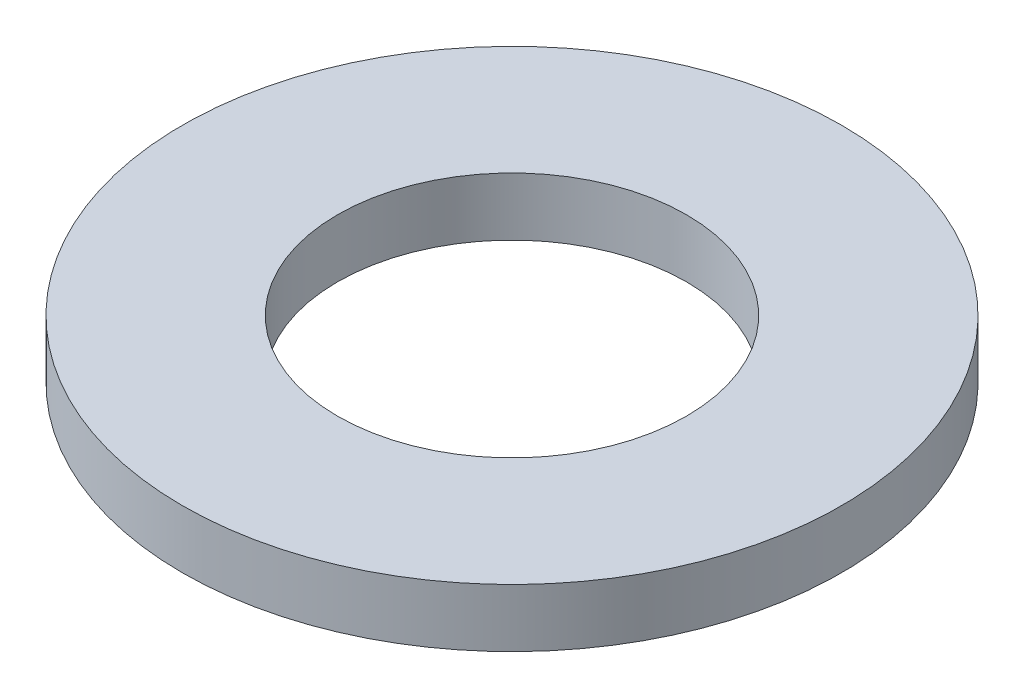
ISO-10303-21;
HEADER;
FILE_DESCRIPTION(('STEP AP214'),'2;1');
FILE_NAME('part.step','',(''),(''),'','','');
FILE_SCHEMA(('AUTOMOTIVE_DESIGN { 1 0 10303 214 1 1 1 1 }'));
ENDSEC;
DATA;
#1=APPLICATION_CONTEXT('core data for automotive mechanical design processes');
#2=APPLICATION_PROTOCOL_DEFINITION('international standard','automotive_design',2000,#1);
#3=PRODUCT_CONTEXT('',#1,'mechanical');
#4=PRODUCT('Part','Part','',(#3));
#5=PRODUCT_RELATED_PRODUCT_CATEGORY('part','',(#4));
#6=PRODUCT_DEFINITION_FORMATION('','',#4);
#7=PRODUCT_DEFINITION_CONTEXT('part definition',#1,'design');
#8=PRODUCT_DEFINITION('design','',#6,#7);
#9=PRODUCT_DEFINITION_SHAPE('','',#8);
#10=(LENGTH_UNIT() NAMED_UNIT(*) SI_UNIT(.MILLI.,.METRE.));
#11=(NAMED_UNIT(*) PLANE_ANGLE_UNIT() SI_UNIT($,.RADIAN.));
#12=(NAMED_UNIT(*) SI_UNIT($,.STERADIAN.) SOLID_ANGLE_UNIT());
#13=UNCERTAINTY_MEASURE_WITH_UNIT(LENGTH_MEASURE(1.E-05),#10,'distance_accuracy_value','');
#14=(GEOMETRIC_REPRESENTATION_CONTEXT(3) GLOBAL_UNCERTAINTY_ASSIGNED_CONTEXT((#13)) GLOBAL_UNIT_ASSIGNED_CONTEXT((#10,
#11,#12)) REPRESENTATION_CONTEXT('',''));
#15=CARTESIAN_POINT('',(0.,0.,0.));
#16=DIRECTION('',(0.,0.,1.));
#17=DIRECTION('',(1.,0.,0.));
#18=AXIS2_PLACEMENT_3D('',#15,#16,#17);
#19=CARTESIAN_POINT('',(0.,1.5,0.));
#20=DIRECTION('',(0.,1.,0.));
#21=DIRECTION('',(0.,0.,1.));
#22=AXIS2_PLACEMENT_3D('',#19,#20,#21);
#23=PLANE('',#22);
#24=CARTESIAN_POINT('',(0.,1.5,0.));
#25=DIRECTION('',(0.,1.,0.));
#26=DIRECTION('',(0.,0.,1.));
#27=AXIS2_PLACEMENT_3D('',#24,#25,#26);
#28=CIRCLE('',#27,8.5);
#29=CARTESIAN_POINT('',(0.,1.5,8.5));
#30=VERTEX_POINT('',#29);
#31=EDGE_CURVE('E10',#30,#30,#28,.T.);
#32=ORIENTED_EDGE('',*,*,#31,.T.);
#33=EDGE_LOOP('',(#32));
#34=FACE_BOUND('',#33,.T.);
#35=CARTESIAN_POINT('',(0.,1.5,0.));
#36=DIRECTION('',(0.,1.,0.));
#37=DIRECTION('',(0.,0.,1.));
#38=AXIS2_PLACEMENT_3D('',#35,#36,#37);
#39=CIRCLE('',#38,4.5);
#40=CARTESIAN_POINT('',(0.,1.5,4.5));
#41=VERTEX_POINT('',#40);
#42=EDGE_CURVE('E42',#41,#41,#39,.T.);
#43=ORIENTED_EDGE('',*,*,#42,.F.);
#44=EDGE_LOOP('',(#43));
#45=FACE_BOUND('',#44,.T.);
#46=ADVANCED_FACE('F31',(#34,#45),#23,.T.);
#47=CARTESIAN_POINT('',(0.,0.,0.));
#48=DIRECTION('',(0.,1.,0.));
#49=DIRECTION('',(0.,0.,1.));
#50=AXIS2_PLACEMENT_3D('',#47,#48,#49);
#51=PLANE('',#50);
#52=CARTESIAN_POINT('',(0.,0.,0.));
#53=DIRECTION('',(0.,1.,0.));
#54=DIRECTION('',(0.,0.,1.));
#55=AXIS2_PLACEMENT_3D('',#52,#53,#54);
#56=CIRCLE('',#55,8.5);
#57=CARTESIAN_POINT('',(0.,0.,8.5));
#58=VERTEX_POINT('',#57);
#59=EDGE_CURVE('E35',#58,#58,#56,.T.);
#60=ORIENTED_EDGE('',*,*,#59,.F.);
#61=EDGE_LOOP('',(#60));
#62=FACE_BOUND('',#61,.T.);
#63=CARTESIAN_POINT('',(0.,0.,0.));
#64=DIRECTION('',(0.,1.,0.));
#65=DIRECTION('',(0.,0.,1.));
#66=AXIS2_PLACEMENT_3D('',#63,#64,#65);
#67=CIRCLE('',#66,4.5);
#68=CARTESIAN_POINT('',(0.,0.,4.5));
#69=VERTEX_POINT('',#68);
#70=EDGE_CURVE('E44',#69,#69,#67,.T.);
#71=ORIENTED_EDGE('',*,*,#70,.T.);
#72=EDGE_LOOP('',(#71));
#73=FACE_BOUND('',#72,.T.);
#74=ADVANCED_FACE('F54',(#62,#73),#51,.F.);
#75=CARTESIAN_POINT('',(0.,1.5,0.));
#76=DIRECTION('',(0.,-1.,0.));
#77=DIRECTION('',(0.,0.,-1.));
#78=AXIS2_PLACEMENT_3D('',#75,#76,#77);
#79=CYLINDRICAL_SURFACE('',#78,8.5);
#80=ORIENTED_EDGE('',*,*,#31,.F.);
#81=EDGE_LOOP('',(#80));
#82=FACE_BOUND('',#81,.T.);
#83=ORIENTED_EDGE('',*,*,#59,.T.);
#84=EDGE_LOOP('',(#83));
#85=FACE_BOUND('',#84,.T.);
#86=ADVANCED_FACE('F33',(#82,#85),#79,.T.);
#87=CARTESIAN_POINT('',(0.,1.5,0.));
#88=DIRECTION('',(0.,-1.,0.));
#89=DIRECTION('',(0.,0.,-1.));
#90=AXIS2_PLACEMENT_3D('',#87,#88,#89);
#91=CYLINDRICAL_SURFACE('',#90,4.5);
#92=ORIENTED_EDGE('',*,*,#42,.T.);
#93=EDGE_LOOP('',(#92));
#94=FACE_BOUND('',#93,.T.);
#95=ORIENTED_EDGE('',*,*,#70,.F.);
#96=EDGE_LOOP('',(#95));
#97=FACE_BOUND('',#96,.T.);
#98=ADVANCED_FACE('F50',(#94,#97),#91,.F.);
#99=CLOSED_SHELL('',(#46,#74,#86,#98));
#100=MANIFOLD_SOLID_BREP('B2',#99);
#101=ADVANCED_BREP_SHAPE_REPRESENTATION('',(#18,#100),#14);
#102=SHAPE_DEFINITION_REPRESENTATION(#9,#101);
ENDSEC;
END-ISO-10303-21;
